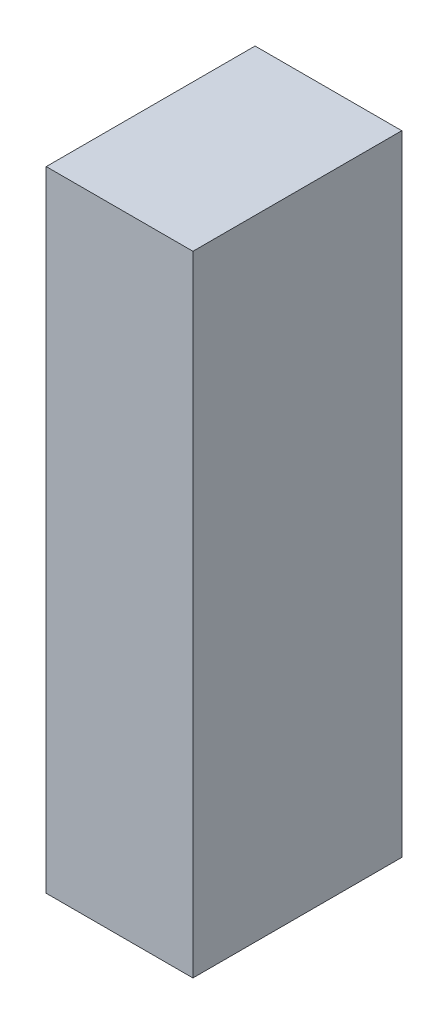
ISO-10303-21;
HEADER;
FILE_DESCRIPTION(('STEP AP214'),'2;1');
FILE_NAME('part.step','',(''),(''),'','','');
FILE_SCHEMA(('AUTOMOTIVE_DESIGN { 1 0 10303 214 1 1 1 1 }'));
ENDSEC;
DATA;
#1=APPLICATION_CONTEXT('core data for automotive mechanical design processes');
#2=APPLICATION_PROTOCOL_DEFINITION('international standard','automotive_design',2000,#1);
#3=PRODUCT_CONTEXT('',#1,'mechanical');
#4=PRODUCT('Part','Part','',(#3));
#5=PRODUCT_RELATED_PRODUCT_CATEGORY('part','',(#4));
#6=PRODUCT_DEFINITION_FORMATION('','',#4);
#7=PRODUCT_DEFINITION_CONTEXT('part definition',#1,'design');
#8=PRODUCT_DEFINITION('design','',#6,#7);
#9=PRODUCT_DEFINITION_SHAPE('','',#8);
#10=(LENGTH_UNIT() NAMED_UNIT(*) SI_UNIT(.MILLI.,.METRE.));
#11=(NAMED_UNIT(*) PLANE_ANGLE_UNIT() SI_UNIT($,.RADIAN.));
#12=(NAMED_UNIT(*) SI_UNIT($,.STERADIAN.) SOLID_ANGLE_UNIT());
#13=UNCERTAINTY_MEASURE_WITH_UNIT(LENGTH_MEASURE(1.E-05),#10,'distance_accuracy_value','');
#14=(GEOMETRIC_REPRESENTATION_CONTEXT(3) GLOBAL_UNCERTAINTY_ASSIGNED_CONTEXT((#13)) GLOBAL_UNIT_ASSIGNED_CONTEXT((#10,
#11,#12)) REPRESENTATION_CONTEXT('',''));
#15=CARTESIAN_POINT('',(0.,0.,0.));
#16=DIRECTION('',(0.,0.,1.));
#17=DIRECTION('',(1.,0.,0.));
#18=AXIS2_PLACEMENT_3D('',#15,#16,#17);
#19=CARTESIAN_POINT('',(0.,0.,10.));
#20=DIRECTION('',(1.,0.,0.));
#21=DIRECTION('',(0.,0.,-1.));
#22=AXIS2_PLACEMENT_3D('',#19,#20,#21);
#23=PLANE('',#22);
#24=DIRECTION('',(0.,-1.,0.));
#25=VECTOR('',#24,1.);
#26=CARTESIAN_POINT('',(0.,0.,0.));
#27=LINE('',#26,#25);
#28=CARTESIAN_POINT('',(0.,30.1351816443595,0.));
#29=VERTEX_POINT('',#28);
#30=CARTESIAN_POINT('',(0.,0.,0.));
#31=VERTEX_POINT('',#30);
#32=EDGE_CURVE('E95',#29,#31,#27,.T.);
#33=ORIENTED_EDGE('',*,*,#32,.T.);
#34=DIRECTION('',(0.,0.,-1.));
#35=VECTOR('',#34,1.);
#36=CARTESIAN_POINT('',(0.,0.,10.));
#37=LINE('',#36,#35);
#38=CARTESIAN_POINT('',(0.,0.,10.));
#39=VERTEX_POINT('',#38);
#40=EDGE_CURVE('E11',#39,#31,#37,.T.);
#41=ORIENTED_EDGE('',*,*,#40,.F.);
#42=DIRECTION('',(0.,-1.,0.));
#43=VECTOR('',#42,1.);
#44=CARTESIAN_POINT('',(0.,0.,10.));
#45=LINE('',#44,#43);
#46=CARTESIAN_POINT('',(0.,30.1351816443595,10.));
#47=VERTEX_POINT('',#46);
#48=EDGE_CURVE('E83',#47,#39,#45,.T.);
#49=ORIENTED_EDGE('',*,*,#48,.F.);
#50=DIRECTION('',(0.,0.,-1.));
#51=VECTOR('',#50,1.);
#52=CARTESIAN_POINT('',(0.,30.1351816443595,10.));
#53=LINE('',#52,#51);
#54=EDGE_CURVE('E91',#47,#29,#53,.T.);
#55=ORIENTED_EDGE('',*,*,#54,.T.);
#56=EDGE_LOOP('',(#33,#41,#49,#55));
#57=FACE_BOUND('',#56,.T.);
#58=ADVANCED_FACE('F32',(#57),#23,.F.);
#59=CARTESIAN_POINT('',(0.,0.,10.));
#60=DIRECTION('',(0.,1.,0.));
#61=DIRECTION('',(0.,0.,1.));
#62=AXIS2_PLACEMENT_3D('',#59,#60,#61);
#63=PLANE('',#62);
#64=DIRECTION('',(1.,0.,0.));
#65=VECTOR('',#64,1.);
#66=CARTESIAN_POINT('',(0.,0.,0.));
#67=LINE('',#66,#65);
#68=CARTESIAN_POINT('',(7.02406051661589,0.,0.));
#69=VERTEX_POINT('',#68);
#70=EDGE_CURVE('E87',#31,#69,#67,.T.);
#71=ORIENTED_EDGE('',*,*,#70,.T.);
#72=DIRECTION('',(0.,0.,-1.));
#73=VECTOR('',#72,1.);
#74=CARTESIAN_POINT('',(7.02406051661589,0.,10.));
#75=LINE('',#74,#73);
#76=CARTESIAN_POINT('',(7.02406051661589,0.,10.));
#77=VERTEX_POINT('',#76);
#78=EDGE_CURVE('E40',#77,#69,#75,.T.);
#79=ORIENTED_EDGE('',*,*,#78,.F.);
#80=DIRECTION('',(1.,0.,0.));
#81=VECTOR('',#80,1.);
#82=CARTESIAN_POINT('',(0.,0.,10.));
#83=LINE('',#82,#81);
#84=EDGE_CURVE('E78',#39,#77,#83,.T.);
#85=ORIENTED_EDGE('',*,*,#84,.F.);
#86=ORIENTED_EDGE('',*,*,#40,.T.);
#87=EDGE_LOOP('',(#71,#79,#85,#86));
#88=FACE_BOUND('',#87,.T.);
#89=ADVANCED_FACE('F86',(#88),#63,.F.);
#90=CARTESIAN_POINT('',(7.02406051661589,0.,10.));
#91=DIRECTION('',(-1.,0.,0.));
#92=DIRECTION('',(0.,0.,1.));
#93=AXIS2_PLACEMENT_3D('',#90,#91,#92);
#94=PLANE('',#93);
#95=DIRECTION('',(0.,1.,0.));
#96=VECTOR('',#95,1.);
#97=CARTESIAN_POINT('',(7.02406051661589,0.,0.));
#98=LINE('',#97,#96);
#99=CARTESIAN_POINT('',(7.02406051661589,30.1351816443595,0.));
#100=VERTEX_POINT('',#99);
#101=EDGE_CURVE('E65',#69,#100,#98,.T.);
#102=ORIENTED_EDGE('',*,*,#101,.T.);
#103=DIRECTION('',(0.,0.,-1.));
#104=VECTOR('',#103,1.);
#105=CARTESIAN_POINT('',(7.02406051661589,30.1351816443595,10.));
#106=LINE('',#105,#104);
#107=CARTESIAN_POINT('',(7.02406051661589,30.1351816443595,10.));
#108=VERTEX_POINT('',#107);
#109=EDGE_CURVE('E88',#108,#100,#106,.T.);
#110=ORIENTED_EDGE('',*,*,#109,.F.);
#111=DIRECTION('',(0.,1.,0.));
#112=VECTOR('',#111,1.);
#113=CARTESIAN_POINT('',(7.02406051661589,0.,10.));
#114=LINE('',#113,#112);
#115=EDGE_CURVE('E81',#77,#108,#114,.T.);
#116=ORIENTED_EDGE('',*,*,#115,.F.);
#117=ORIENTED_EDGE('',*,*,#78,.T.);
#118=EDGE_LOOP('',(#102,#110,#116,#117));
#119=FACE_BOUND('',#118,.T.);
#120=ADVANCED_FACE('F89',(#119),#94,.F.);
#121=CARTESIAN_POINT('',(0.,30.1351816443595,10.));
#122=DIRECTION('',(0.,-1.,0.));
#123=DIRECTION('',(0.,0.,-1.));
#124=AXIS2_PLACEMENT_3D('',#121,#122,#123);
#125=PLANE('',#124);
#126=DIRECTION('',(-1.,0.,0.));
#127=VECTOR('',#126,1.);
#128=CARTESIAN_POINT('',(0.,30.1351816443595,0.));
#129=LINE('',#128,#127);
#130=EDGE_CURVE('E71',#100,#29,#129,.T.);
#131=ORIENTED_EDGE('',*,*,#130,.T.);
#132=ORIENTED_EDGE('',*,*,#54,.F.);
#133=DIRECTION('',(-1.,0.,0.));
#134=VECTOR('',#133,1.);
#135=CARTESIAN_POINT('',(0.,30.1351816443595,10.));
#136=LINE('',#135,#134);
#137=EDGE_CURVE('E48',#108,#47,#136,.T.);
#138=ORIENTED_EDGE('',*,*,#137,.F.);
#139=ORIENTED_EDGE('',*,*,#109,.T.);
#140=EDGE_LOOP('',(#131,#132,#138,#139));
#141=FACE_BOUND('',#140,.T.);
#142=ADVANCED_FACE('F102',(#141),#125,.F.);
#143=CARTESIAN_POINT('',(0.,30.1351816443595,10.));
#144=DIRECTION('',(0.,0.,-1.));
#145=DIRECTION('',(-1.,0.,0.));
#146=AXIS2_PLACEMENT_3D('',#143,#144,#145);
#147=PLANE('',#146);
#148=ORIENTED_EDGE('',*,*,#48,.T.);
#149=ORIENTED_EDGE('',*,*,#84,.T.);
#150=ORIENTED_EDGE('',*,*,#115,.T.);
#151=ORIENTED_EDGE('',*,*,#137,.T.);
#152=EDGE_LOOP('',(#148,#149,#150,#151));
#153=FACE_BOUND('',#152,.T.);
#154=ADVANCED_FACE('F79',(#153),#147,.F.);
#155=CARTESIAN_POINT('',(0.,30.1351816443595,0.));
#156=DIRECTION('',(0.,0.,-1.));
#157=DIRECTION('',(-1.,0.,0.));
#158=AXIS2_PLACEMENT_3D('',#155,#156,#157);
#159=PLANE('',#158);
#160=ORIENTED_EDGE('',*,*,#32,.F.);
#161=ORIENTED_EDGE('',*,*,#130,.F.);
#162=ORIENTED_EDGE('',*,*,#101,.F.);
#163=ORIENTED_EDGE('',*,*,#70,.F.);
#164=EDGE_LOOP('',(#160,#161,#162,#163));
#165=FACE_BOUND('',#164,.T.);
#166=ADVANCED_FACE('F105',(#165),#159,.T.);
#167=CLOSED_SHELL('',(#58,#89,#120,#142,#154,#166));
#168=MANIFOLD_SOLID_BREP('B2',#167);
#169=ADVANCED_BREP_SHAPE_REPRESENTATION('',(#18,#168),#14);
#170=SHAPE_DEFINITION_REPRESENTATION(#9,#169);
ENDSEC;
END-ISO-10303-21;
